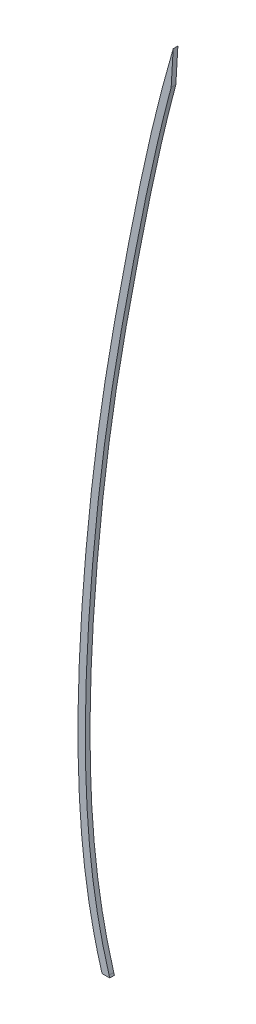
ISO-10303-21;
HEADER;
FILE_DESCRIPTION(('STEP AP214'),'2;1');
FILE_NAME('part.step','',(''),(''),'','','');
FILE_SCHEMA(('AUTOMOTIVE_DESIGN { 1 0 10303 214 1 1 1 1 }'));
ENDSEC;
DATA;
#1=APPLICATION_CONTEXT('core data for automotive mechanical design processes');
#2=APPLICATION_PROTOCOL_DEFINITION('international standard','automotive_design',2000,#1);
#3=PRODUCT_CONTEXT('',#1,'mechanical');
#4=PRODUCT('Part','Part','',(#3));
#5=PRODUCT_RELATED_PRODUCT_CATEGORY('part','',(#4));
#6=PRODUCT_DEFINITION_FORMATION('','',#4);
#7=PRODUCT_DEFINITION_CONTEXT('part definition',#1,'design');
#8=PRODUCT_DEFINITION('design','',#6,#7);
#9=PRODUCT_DEFINITION_SHAPE('','',#8);
#10=(LENGTH_UNIT() NAMED_UNIT(*) SI_UNIT(.MILLI.,.METRE.));
#11=(NAMED_UNIT(*) PLANE_ANGLE_UNIT() SI_UNIT($,.RADIAN.));
#12=(NAMED_UNIT(*) SI_UNIT($,.STERADIAN.) SOLID_ANGLE_UNIT());
#13=UNCERTAINTY_MEASURE_WITH_UNIT(LENGTH_MEASURE(1.E-05),#10,'distance_accuracy_value','');
#14=(GEOMETRIC_REPRESENTATION_CONTEXT(3) GLOBAL_UNCERTAINTY_ASSIGNED_CONTEXT((#13)) GLOBAL_UNIT_ASSIGNED_CONTEXT((#10,
#11,#12)) REPRESENTATION_CONTEXT('',''));
#15=CARTESIAN_POINT('',(0.,0.,0.));
#16=DIRECTION('',(0.,0.,1.));
#17=DIRECTION('',(1.,0.,0.));
#18=AXIS2_PLACEMENT_3D('',#15,#16,#17);
#19=CARTESIAN_POINT('',(-48.3860276005765,-578.566789910099,3.2));
#20=CARTESIAN_POINT('',(-51.7803905777078,-567.22194753509,3.2));
#21=CARTESIAN_POINT('',(-57.2557409873564,-544.144931603079,3.2));
#22=CARTESIAN_POINT('',(-62.1493985599401,-508.831952672007,3.2));
#23=CARTESIAN_POINT('',(-64.4124660304246,-473.037439635885,3.2));
#24=CARTESIAN_POINT('',(-64.7598966344537,-437.068166330361,3.2));
#25=CARTESIAN_POINT('',(-63.7493992276419,-401.17131880639,3.2));
#26=CARTESIAN_POINT('',(-61.6036812100741,-365.309028431765,3.2));
#27=CARTESIAN_POINT('',(-58.6505033054231,-329.474788161962,3.2));
#28=CARTESIAN_POINT('',(-54.9638335849076,-293.729962154829,3.2));
#29=CARTESIAN_POINT('',(-50.4583884916797,-258.090690177413,3.2));
#30=CARTESIAN_POINT('',(-45.0528822931716,-222.571282312389,3.2));
#31=CARTESIAN_POINT('',(-38.9125556620529,-187.119022752938,3.2));
#32=CARTESIAN_POINT('',(-30.0510727146758,-139.897301168073,3.2));
#33=CARTESIAN_POINT('',(-18.3112391186401,-81.0288112017888,3.2));
#34=CARTESIAN_POINT('',(-6.672095735146,-34.6231902844,3.2));
#35=CARTESIAN_POINT('',(0.0669367747265921,-11.6640707638458,3.2));
#36=B_SPLINE_CURVE_WITH_KNOTS('',3,(#19,#20,#21,#22,#23,#24,#25,#26,#27,#28,#29,#30,#31,#32,#33,
#34,#35),.UNSPECIFIED.,.F.,.F.,(4,1,1,1,1,1,1,1,1,1,1,1,1,1,4),(0.018209110906077,
0.0795710414744472,0.140932972042817,0.202294902611188,0.263656833179558,0.325018763747928,
0.386380694316298,0.447742624884668,0.509104555453039,0.570466486021409,0.631828416589779,
0.693190347158149,0.754552277726519,0.87727613886326,1.),.UNSPECIFIED.);
#37=DIRECTION('',(0.,0.,-1.));
#38=VECTOR('',#37,1.);
#39=SURFACE_OF_LINEAR_EXTRUSION('',#36,#38);
#40=CARTESIAN_POINT('',(-48.3860276005765,-578.566789910099,0.));
#41=CARTESIAN_POINT('',(-51.7803905777078,-567.22194753509,0.));
#42=CARTESIAN_POINT('',(-57.2557409873564,-544.144931603079,0.));
#43=CARTESIAN_POINT('',(-62.1493985599401,-508.831952672007,0.));
#44=CARTESIAN_POINT('',(-64.4124660304246,-473.037439635885,0.));
#45=CARTESIAN_POINT('',(-64.7598966344537,-437.068166330361,0.));
#46=CARTESIAN_POINT('',(-63.7493992276419,-401.17131880639,0.));
#47=CARTESIAN_POINT('',(-61.6036812100741,-365.309028431765,0.));
#48=CARTESIAN_POINT('',(-58.6505033054231,-329.474788161962,0.));
#49=CARTESIAN_POINT('',(-54.9638335849076,-293.729962154829,0.));
#50=CARTESIAN_POINT('',(-50.4583884916797,-258.090690177413,0.));
#51=CARTESIAN_POINT('',(-45.0528822931716,-222.571282312389,0.));
#52=CARTESIAN_POINT('',(-38.9125556620529,-187.119022752938,0.));
#53=CARTESIAN_POINT('',(-30.0510727146758,-139.897301168073,0.));
#54=CARTESIAN_POINT('',(-18.3112391186401,-81.0288112017888,0.));
#55=CARTESIAN_POINT('',(-6.672095735146,-34.6231902844,0.));
#56=CARTESIAN_POINT('',(0.0669367747265921,-11.6640707638458,0.));
#57=B_SPLINE_CURVE_WITH_KNOTS('',3,(#40,#41,#42,#43,#44,#45,#46,#47,#48,#49,#50,#51,#52,#53,#54,
#55,#56),.UNSPECIFIED.,.F.,.F.,(4,1,1,1,1,1,1,1,1,1,1,1,1,1,4),(0.018209110906077,
0.0795710414744472,0.140932972042817,0.202294902611188,0.263656833179558,0.325018763747928,
0.386380694316298,0.447742624884668,0.509104555453039,0.570466486021409,0.631828416589779,
0.693190347158149,0.754552277726519,0.87727613886326,1.),.UNSPECIFIED.);
#58=CARTESIAN_POINT('',(-48.3860276005765,-578.566789910099,0.));
#59=VERTEX_POINT('',#58);
#60=CARTESIAN_POINT('',(-6.10955889503451,-33.6943139109326,0.));
#61=VERTEX_POINT('',#60);
#62=EDGE_CURVE('E113',#59,#61,#57,.T.);
#63=ORIENTED_EDGE('',*,*,#62,.T.);
#64=DIRECTION('',(0.,0.,-1.));
#65=VECTOR('',#64,1.);
#66=CARTESIAN_POINT('',(-6.10955889503451,-33.6943139109326,3.2));
#67=LINE('',#66,#65);
#68=CARTESIAN_POINT('',(-6.10955889503451,-33.6943139109326,3.2));
#69=VERTEX_POINT('',#68);
#70=EDGE_CURVE('E11',#69,#61,#67,.T.);
#71=ORIENTED_EDGE('',*,*,#70,.F.);
#72=CARTESIAN_POINT('',(-48.3860276005765,-578.566789910099,3.2));
#73=VERTEX_POINT('',#72);
#74=EDGE_CURVE('E131',#73,#69,#36,.T.);
#75=ORIENTED_EDGE('',*,*,#74,.F.);
#76=DIRECTION('',(0.,0.,-1.));
#77=VECTOR('',#76,1.);
#78=CARTESIAN_POINT('',(-48.3860276005765,-578.566789910099,3.2));
#79=LINE('',#78,#77);
#80=EDGE_CURVE('E106',#73,#59,#79,.T.);
#81=ORIENTED_EDGE('',*,*,#80,.T.);
#82=EDGE_LOOP('',(#63,#71,#75,#81));
#83=FACE_BOUND('',#82,.T.);
#84=ADVANCED_FACE('F35',(#83),#39,.F.);
#85=CARTESIAN_POINT('',(-4.72969832613487,-10.2561218575484,3.2));
#86=DIRECTION('',(-0.99827151723526,0.0587705528033531,0.));
#87=DIRECTION('',(-0.0587705528033531,-0.99827151723526,0.));
#88=AXIS2_PLACEMENT_3D('',#85,#86,#87);
#89=PLANE('',#88);
#90=DIRECTION('',(0.0587705528033531,0.99827151723526,0.));
#91=VECTOR('',#90,1.);
#92=CARTESIAN_POINT('',(-4.72969832613487,-10.2561218575484,0.));
#93=LINE('',#92,#91);
#94=CARTESIAN_POINT('',(-4.72969832613487,-10.2561218575484,0.));
#95=VERTEX_POINT('',#94);
#96=EDGE_CURVE('E118',#61,#95,#93,.T.);
#97=ORIENTED_EDGE('',*,*,#96,.T.);
#98=DIRECTION('',(0.,0.,-1.));
#99=VECTOR('',#98,1.);
#100=CARTESIAN_POINT('',(-4.72969832613487,-10.2561218575484,3.2));
#101=LINE('',#100,#99);
#102=CARTESIAN_POINT('',(-4.72969832613487,-10.2561218575484,3.2));
#103=VERTEX_POINT('',#102);
#104=EDGE_CURVE('E44',#103,#95,#101,.T.);
#105=ORIENTED_EDGE('',*,*,#104,.F.);
#106=DIRECTION('',(0.0587705528033531,0.99827151723526,0.));
#107=VECTOR('',#106,1.);
#108=CARTESIAN_POINT('',(-4.72969832613487,-10.2561218575484,3.2));
#109=LINE('',#108,#107);
#110=EDGE_CURVE('E86',#69,#103,#109,.T.);
#111=ORIENTED_EDGE('',*,*,#110,.F.);
#112=ORIENTED_EDGE('',*,*,#70,.T.);
#113=EDGE_LOOP('',(#97,#105,#111,#112));
#114=FACE_BOUND('',#113,.T.);
#115=ADVANCED_FACE('F150',(#114),#89,.F.);
#116=CARTESIAN_POINT('',(-4.72969832613487,-10.2561218575484,3.2));
#117=CARTESIAN_POINT('',(-8.59723263997898,-23.4322886438157,3.2));
#118=CARTESIAN_POINT('',(-21.0317157200405,-69.6080629125404,3.2));
#119=CARTESIAN_POINT('',(-37.2950534860383,-149.666311037929,3.2));
#120=CARTESIAN_POINT('',(-55.3462055023351,-249.581342158538,3.2));
#121=CARTESIAN_POINT('',(-66.2349104757902,-349.711613780141,3.2));
#122=CARTESIAN_POINT('',(-72.032198263993,-460.286609496219,3.2));
#123=CARTESIAN_POINT('',(-65.753581712952,-537.962915804208,3.2));
#124=CARTESIAN_POINT('',(-53.1762165329365,-579.999999592,3.2));
#125=B_SPLINE_CURVE_WITH_KNOTS('',3,(#116,#117,#118,#119,#120,#121,#122,#123,#124),
.UNSPECIFIED.,.F.,.F.,(4,1,1,1,1,1,4),(0.018209110906077,0.0882789641743432,0.262319454469616,
0.434981473786181,0.606296405014112,0.776566769253324,1.),.UNSPECIFIED.);
#126=DIRECTION('',(0.,0.,-1.));
#127=VECTOR('',#126,1.);
#128=SURFACE_OF_LINEAR_EXTRUSION('',#125,#127);
#129=CARTESIAN_POINT('',(-4.72969832613487,-10.2561218575484,0.));
#130=CARTESIAN_POINT('',(-8.59723263997898,-23.4322886438157,0.));
#131=CARTESIAN_POINT('',(-21.0317157200405,-69.6080629125404,0.));
#132=CARTESIAN_POINT('',(-37.2950534860383,-149.666311037929,0.));
#133=CARTESIAN_POINT('',(-55.3462055023351,-249.581342158538,0.));
#134=CARTESIAN_POINT('',(-66.2349104757902,-349.711613780141,0.));
#135=CARTESIAN_POINT('',(-72.032198263993,-460.286609496219,0.));
#136=CARTESIAN_POINT('',(-65.753581712952,-537.962915804208,0.));
#137=CARTESIAN_POINT('',(-53.1762165329365,-579.999999592,0.));
#138=B_SPLINE_CURVE_WITH_KNOTS('',3,(#129,#130,#131,#132,#133,#134,#135,#136,#137),
.UNSPECIFIED.,.F.,.F.,(4,1,1,1,1,1,4),(0.018209110906077,0.0882789641743432,0.262319454469616,
0.434981473786181,0.606296405014112,0.776566769253324,1.),.UNSPECIFIED.);
#139=CARTESIAN_POINT('',(-53.1762165329365,-579.999999592,0.));
#140=VERTEX_POINT('',#139);
#141=EDGE_CURVE('E101',#95,#140,#138,.T.);
#142=ORIENTED_EDGE('',*,*,#141,.T.);
#143=DIRECTION('',(0.,0.,-1.));
#144=VECTOR('',#143,1.);
#145=CARTESIAN_POINT('',(-53.1762165329365,-579.999999592,3.2));
#146=LINE('',#145,#144);
#147=CARTESIAN_POINT('',(-53.1762165329365,-579.999999592,3.2));
#148=VERTEX_POINT('',#147);
#149=EDGE_CURVE('E98',#148,#140,#146,.T.);
#150=ORIENTED_EDGE('',*,*,#149,.F.);
#151=EDGE_CURVE('E90',#103,#148,#125,.T.);
#152=ORIENTED_EDGE('',*,*,#151,.F.);
#153=ORIENTED_EDGE('',*,*,#104,.T.);
#154=EDGE_LOOP('',(#142,#150,#152,#153));
#155=FACE_BOUND('',#154,.T.);
#156=ADVANCED_FACE('F99',(#155),#128,.F.);
#157=CARTESIAN_POINT('',(-47.9572157058244,-579.999999592,3.2));
#158=DIRECTION('',(0.,1.,0.));
#159=DIRECTION('',(0.,0.,1.));
#160=AXIS2_PLACEMENT_3D('',#157,#158,#159);
#161=PLANE('',#160);
#162=DIRECTION('',(1.,0.,0.));
#163=VECTOR('',#162,1.);
#164=CARTESIAN_POINT('',(-47.9572157058244,-579.999999592,0.));
#165=LINE('',#164,#163);
#166=CARTESIAN_POINT('',(-47.9572157058244,-579.999999592,0.));
#167=VERTEX_POINT('',#166);
#168=EDGE_CURVE('E72',#140,#167,#165,.T.);
#169=ORIENTED_EDGE('',*,*,#168,.T.);
#170=DIRECTION('',(0.,0.,-1.));
#171=VECTOR('',#170,1.);
#172=CARTESIAN_POINT('',(-47.9572157058244,-579.999999592,3.2));
#173=LINE('',#172,#171);
#174=CARTESIAN_POINT('',(-47.9572157058244,-579.999999592,3.2));
#175=VERTEX_POINT('',#174);
#176=EDGE_CURVE('E102',#175,#167,#173,.T.);
#177=ORIENTED_EDGE('',*,*,#176,.F.);
#178=DIRECTION('',(1.,0.,0.));
#179=VECTOR('',#178,1.);
#180=CARTESIAN_POINT('',(-47.9572157058244,-579.999999592,3.2));
#181=LINE('',#180,#179);
#182=EDGE_CURVE('E94',#148,#175,#181,.T.);
#183=ORIENTED_EDGE('',*,*,#182,.F.);
#184=ORIENTED_EDGE('',*,*,#149,.T.);
#185=EDGE_LOOP('',(#169,#177,#183,#184));
#186=FACE_BOUND('',#185,.T.);
#187=ADVANCED_FACE('F104',(#186),#161,.F.);
#188=CARTESIAN_POINT('',(-48.3860276005765,-578.566789910099,3.2));
#189=DIRECTION('',(-0.958037786471618,-0.286641936381546,0.));
#190=DIRECTION('',(0.286641936381546,-0.958037786471618,0.));
#191=AXIS2_PLACEMENT_3D('',#188,#189,#190);
#192=PLANE('',#191);
#193=DIRECTION('',(-0.286641936381546,0.958037786471618,0.));
#194=VECTOR('',#193,1.);
#195=CARTESIAN_POINT('',(-48.3860276005765,-578.566789910099,0.));
#196=LINE('',#195,#194);
#197=EDGE_CURVE('E78',#167,#59,#196,.T.);
#198=ORIENTED_EDGE('',*,*,#197,.T.);
#199=ORIENTED_EDGE('',*,*,#80,.F.);
#200=DIRECTION('',(-0.286641936381546,0.958037786471618,0.));
#201=VECTOR('',#200,1.);
#202=CARTESIAN_POINT('',(-48.3860276005765,-578.566789910099,3.2));
#203=LINE('',#202,#201);
#204=EDGE_CURVE('E52',#175,#73,#203,.T.);
#205=ORIENTED_EDGE('',*,*,#204,.F.);
#206=ORIENTED_EDGE('',*,*,#176,.T.);
#207=EDGE_LOOP('',(#198,#199,#205,#206));
#208=FACE_BOUND('',#207,.T.);
#209=ADVANCED_FACE('F139',(#208),#192,.F.);
#210=CARTESIAN_POINT('',(-54.8273710227889,-293.747554493115,3.2));
#211=DIRECTION('',(0.,0.,-1.));
#212=DIRECTION('',(-1.,0.,0.));
#213=AXIS2_PLACEMENT_3D('',#210,#211,#212);
#214=PLANE('',#213);
#215=ORIENTED_EDGE('',*,*,#74,.T.);
#216=ORIENTED_EDGE('',*,*,#110,.T.);
#217=ORIENTED_EDGE('',*,*,#151,.T.);
#218=ORIENTED_EDGE('',*,*,#182,.T.);
#219=ORIENTED_EDGE('',*,*,#204,.T.);
#220=EDGE_LOOP('',(#215,#216,#217,#218,#219));
#221=FACE_BOUND('',#220,.T.);
#222=ADVANCED_FACE('F92',(#221),#214,.F.);
#223=CARTESIAN_POINT('',(-54.8273710227889,-293.747554493115,0.));
#224=DIRECTION('',(0.,0.,-1.));
#225=DIRECTION('',(-1.,0.,0.));
#226=AXIS2_PLACEMENT_3D('',#223,#224,#225);
#227=PLANE('',#226);
#228=ORIENTED_EDGE('',*,*,#62,.F.);
#229=ORIENTED_EDGE('',*,*,#197,.F.);
#230=ORIENTED_EDGE('',*,*,#168,.F.);
#231=ORIENTED_EDGE('',*,*,#141,.F.);
#232=ORIENTED_EDGE('',*,*,#96,.F.);
#233=EDGE_LOOP('',(#228,#229,#230,#231,#232));
#234=FACE_BOUND('',#233,.T.);
#235=ADVANCED_FACE('F135',(#234),#227,.T.);
#236=CLOSED_SHELL('',(#84,#115,#156,#187,#209,#222,#235));
#237=MANIFOLD_SOLID_BREP('B2',#236);
#238=ADVANCED_BREP_SHAPE_REPRESENTATION('',(#18,#237),#14);
#239=SHAPE_DEFINITION_REPRESENTATION(#9,#238);
ENDSEC;
END-ISO-10303-21;
